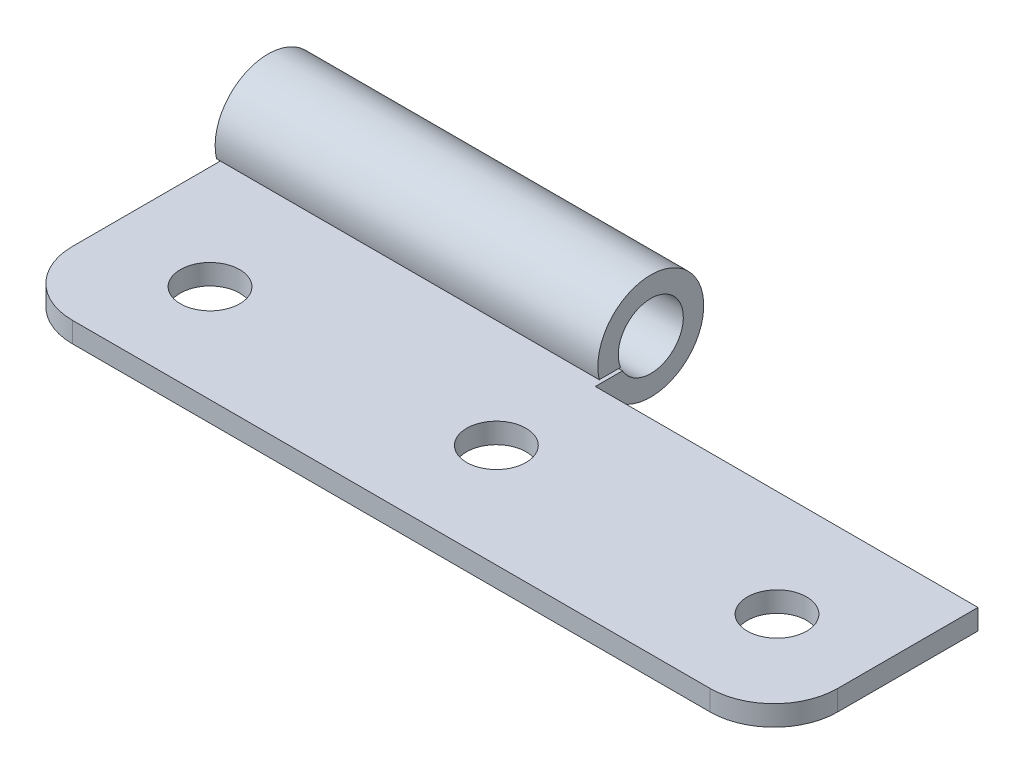
ISO-10303-21;
HEADER;
FILE_DESCRIPTION(('STEP AP214'),'2;1');
FILE_NAME('part.step','',(''),(''),'','','');
FILE_SCHEMA(('AUTOMOTIVE_DESIGN { 1 0 10303 214 1 1 1 1 }'));
ENDSEC;
DATA;
#1=APPLICATION_CONTEXT('core data for automotive mechanical design processes');
#2=APPLICATION_PROTOCOL_DEFINITION('international standard','automotive_design',2000,#1);
#3=PRODUCT_CONTEXT('',#1,'mechanical');
#4=PRODUCT('Part','Part','',(#3));
#5=PRODUCT_RELATED_PRODUCT_CATEGORY('part','',(#4));
#6=PRODUCT_DEFINITION_FORMATION('','',#4);
#7=PRODUCT_DEFINITION_CONTEXT('part definition',#1,'design');
#8=PRODUCT_DEFINITION('design','',#6,#7);
#9=PRODUCT_DEFINITION_SHAPE('','',#8);
#10=(LENGTH_UNIT() NAMED_UNIT(*) SI_UNIT(.MILLI.,.METRE.));
#11=(NAMED_UNIT(*) PLANE_ANGLE_UNIT() SI_UNIT($,.RADIAN.));
#12=(NAMED_UNIT(*) SI_UNIT($,.STERADIAN.) SOLID_ANGLE_UNIT());
#13=UNCERTAINTY_MEASURE_WITH_UNIT(LENGTH_MEASURE(1.E-05),#10,'distance_accuracy_value','');
#14=(GEOMETRIC_REPRESENTATION_CONTEXT(3) GLOBAL_UNCERTAINTY_ASSIGNED_CONTEXT((#13)) GLOBAL_UNIT_ASSIGNED_CONTEXT((#10,
#11,#12)) REPRESENTATION_CONTEXT('',''));
#15=CARTESIAN_POINT('',(0.,0.,0.));
#16=DIRECTION('',(0.,0.,1.));
#17=DIRECTION('',(1.,0.,0.));
#18=AXIS2_PLACEMENT_3D('',#15,#16,#17);
#19=CARTESIAN_POINT('',(60.,0.,0.));
#20=DIRECTION('',(-1.,0.,0.));
#21=DIRECTION('',(0.,0.,1.));
#22=AXIS2_PLACEMENT_3D('',#19,#20,#21);
#23=CYLINDRICAL_SURFACE('',#22,4.15);
#24=CARTESIAN_POINT('',(30.,0.,0.));
#25=DIRECTION('',(-1.,0.,0.));
#26=DIRECTION('',(0.,0.,1.));
#27=AXIS2_PLACEMENT_3D('',#24,#25,#26);
#28=CIRCLE('',#27,4.15);
#29=CARTESIAN_POINT('',(30.,-0.95,4.03980197534483));
#30=VERTEX_POINT('',#29);
#31=CARTESIAN_POINT('',(30.,-2.85,3.01662062579967));
#32=VERTEX_POINT('',#31);
#33=EDGE_CURVE('E56',#30,#32,#28,.T.);
#34=ORIENTED_EDGE('',*,*,#33,.T.);
#35=DIRECTION('',(-1.,0.,0.));
#36=VECTOR('',#35,1.);
#37=CARTESIAN_POINT('',(60.,-2.85,3.01662062579967));
#38=LINE('',#37,#36);
#39=CARTESIAN_POINT('',(0.,-2.85,3.01662062579967));
#40=VERTEX_POINT('',#39);
#41=EDGE_CURVE('E153',#32,#40,#38,.T.);
#42=ORIENTED_EDGE('',*,*,#41,.T.);
#43=CARTESIAN_POINT('',(0.,0.,0.));
#44=DIRECTION('',(1.,0.,0.));
#45=DIRECTION('',(0.,0.,-1.));
#46=AXIS2_PLACEMENT_3D('',#43,#44,#45);
#47=CIRCLE('',#46,4.15);
#48=CARTESIAN_POINT('',(0.,-0.95,4.03980197534483));
#49=VERTEX_POINT('',#48);
#50=EDGE_CURVE('E155',#40,#49,#47,.T.);
#51=ORIENTED_EDGE('',*,*,#50,.T.);
#52=DIRECTION('',(-1.,0.,0.));
#53=VECTOR('',#52,1.);
#54=CARTESIAN_POINT('',(60.,-0.95,4.03980197534483));
#55=LINE('',#54,#53);
#56=EDGE_CURVE('E63',#30,#49,#55,.T.);
#57=ORIENTED_EDGE('',*,*,#56,.F.);
#58=EDGE_LOOP('',(#34,#42,#51,#57));
#59=FACE_BOUND('',#58,.T.);
#60=ADVANCED_FACE('F41',(#59),#23,.T.);
#61=CARTESIAN_POINT('',(60.,0.,0.));
#62=DIRECTION('',(1.,0.,0.));
#63=DIRECTION('',(0.,0.,-1.));
#64=AXIS2_PLACEMENT_3D('',#61,#62,#63);
#65=PLANE('',#64);
#66=DIRECTION('',(0.,1.,0.));
#67=VECTOR('',#66,1.);
#68=CARTESIAN_POINT('',(60.,-4.15,4.35000000000001));
#69=LINE('',#68,#67);
#70=CARTESIAN_POINT('',(60.,-2.85,4.35000000000001));
#71=VERTEX_POINT('',#70);
#72=CARTESIAN_POINT('',(60.,-1.25,4.35000000000001));
#73=VERTEX_POINT('',#72);
#74=EDGE_CURVE('E117',#71,#73,#69,.T.);
#75=ORIENTED_EDGE('',*,*,#74,.T.);
#76=DIRECTION('',(0.,0.,-1.));
#77=VECTOR('',#76,1.);
#78=CARTESIAN_POINT('',(60.,-1.25,4.15));
#79=LINE('',#78,#77);
#80=CARTESIAN_POINT('',(60.,-1.25,15.35));
#81=VERTEX_POINT('',#80);
#82=EDGE_CURVE('E156',#81,#73,#79,.T.);
#83=ORIENTED_EDGE('',*,*,#82,.F.);
#84=DIRECTION('',(0.,-1.,0.));
#85=VECTOR('',#84,1.);
#86=CARTESIAN_POINT('',(60.,-2.85,15.35));
#87=LINE('',#86,#85);
#88=CARTESIAN_POINT('',(60.,-2.85,15.35));
#89=VERTEX_POINT('',#88);
#90=EDGE_CURVE('E142',#81,#89,#87,.T.);
#91=ORIENTED_EDGE('',*,*,#90,.T.);
#92=DIRECTION('',(0.,0.,-1.));
#93=VECTOR('',#92,1.);
#94=CARTESIAN_POINT('',(60.,-2.85,0.));
#95=LINE('',#94,#93);
#96=EDGE_CURVE('E136',#89,#71,#95,.T.);
#97=ORIENTED_EDGE('',*,*,#96,.T.);
#98=EDGE_LOOP('',(#75,#83,#91,#97));
#99=FACE_BOUND('',#98,.T.);
#100=ADVANCED_FACE('F140',(#99),#65,.T.);
#101=CARTESIAN_POINT('',(0.,0.,0.));
#102=DIRECTION('',(1.,0.,0.));
#103=DIRECTION('',(0.,0.,-1.));
#104=AXIS2_PLACEMENT_3D('',#101,#102,#103);
#105=PLANE('',#104);
#106=DIRECTION('',(0.,0.,1.));
#107=VECTOR('',#106,1.);
#108=CARTESIAN_POINT('',(0.,-1.25,4.15));
#109=LINE('',#108,#107);
#110=CARTESIAN_POINT('',(0.,-1.25,2.22261107708929));
#111=VERTEX_POINT('',#110);
#112=CARTESIAN_POINT('',(0.,-1.25,15.35));
#113=VERTEX_POINT('',#112);
#114=EDGE_CURVE('E143',#111,#113,#109,.T.);
#115=ORIENTED_EDGE('',*,*,#114,.F.);
#116=CARTESIAN_POINT('',(0.,0.,0.));
#117=DIRECTION('',(-1.,0.,0.));
#118=DIRECTION('',(0.,0.,1.));
#119=AXIS2_PLACEMENT_3D('',#116,#117,#118);
#120=CIRCLE('',#119,2.55);
#121=CARTESIAN_POINT('',(0.,-0.95,2.36643191323985));
#122=VERTEX_POINT('',#121);
#123=EDGE_CURVE('E181',#122,#111,#120,.T.);
#124=ORIENTED_EDGE('',*,*,#123,.F.);
#125=DIRECTION('',(0.,0.,-1.));
#126=VECTOR('',#125,1.);
#127=CARTESIAN_POINT('',(0.,-0.95,4.03980197534483));
#128=LINE('',#127,#126);
#129=EDGE_CURVE('E186',#49,#122,#128,.T.);
#130=ORIENTED_EDGE('',*,*,#129,.F.);
#131=ORIENTED_EDGE('',*,*,#50,.F.);
#132=DIRECTION('',(0.,0.,1.));
#133=VECTOR('',#132,1.);
#134=CARTESIAN_POINT('',(0.,-2.85,4.15));
#135=LINE('',#134,#133);
#136=CARTESIAN_POINT('',(0.,-2.85,15.35));
#137=VERTEX_POINT('',#136);
#138=EDGE_CURVE('E149',#40,#137,#135,.T.);
#139=ORIENTED_EDGE('',*,*,#138,.T.);
#140=DIRECTION('',(0.,-1.,0.));
#141=VECTOR('',#140,1.);
#142=CARTESIAN_POINT('',(0.,0.,15.35));
#143=LINE('',#142,#141);
#144=EDGE_CURVE('E173',#137,#113,#143,.F.);
#145=ORIENTED_EDGE('',*,*,#144,.T.);
#146=EDGE_LOOP('',(#115,#124,#130,#131,#139,#145));
#147=FACE_BOUND('',#146,.T.);
#148=ADVANCED_FACE('F215',(#147),#105,.F.);
#149=CARTESIAN_POINT('',(0.,-1.25,0.));
#150=DIRECTION('',(0.,-1.,0.));
#151=DIRECTION('',(0.,0.,-1.));
#152=AXIS2_PLACEMENT_3D('',#149,#150,#151);
#153=PLANE('',#152);
#154=CARTESIAN_POINT('',(8.12499999999999,-1.25,12.675));
#155=DIRECTION('',(0.,1.,0.));
#156=DIRECTION('',(0.,0.,1.));
#157=AXIS2_PLACEMENT_3D('',#154,#155,#156);
#158=CIRCLE('',#157,2.32500000000001);
#159=CARTESIAN_POINT('',(8.12499999999999,-1.25,15.));
#160=VERTEX_POINT('',#159);
#161=EDGE_CURVE('E203',#160,#160,#158,.T.);
#162=ORIENTED_EDGE('',*,*,#161,.F.);
#163=EDGE_LOOP('',(#162));
#164=FACE_BOUND('',#163,.T.);
#165=CARTESIAN_POINT('',(30.1191632833642,-1.25,12.225));
#166=DIRECTION('',(0.,1.,0.));
#167=DIRECTION('',(0.,0.,1.));
#168=AXIS2_PLACEMENT_3D('',#165,#166,#167);
#169=CIRCLE('',#168,2.32499999999999);
#170=CARTESIAN_POINT('',(30.1191632833642,-1.25,14.55));
#171=VERTEX_POINT('',#170);
#172=EDGE_CURVE('E197',#171,#171,#169,.T.);
#173=ORIENTED_EDGE('',*,*,#172,.F.);
#174=EDGE_LOOP('',(#173));
#175=FACE_BOUND('',#174,.T.);
#176=CARTESIAN_POINT('',(52.5691632833642,-1.25,12.675));
#177=DIRECTION('',(0.,1.,0.));
#178=DIRECTION('',(0.,0.,1.));
#179=AXIS2_PLACEMENT_3D('',#176,#177,#178);
#180=CIRCLE('',#179,2.32499999999999);
#181=CARTESIAN_POINT('',(52.5691632833642,-1.25,15.));
#182=VERTEX_POINT('',#181);
#183=EDGE_CURVE('E190',#182,#182,#180,.T.);
#184=ORIENTED_EDGE('',*,*,#183,.F.);
#185=EDGE_LOOP('',(#184));
#186=FACE_BOUND('',#185,.T.);
#187=DIRECTION('',(-1.,0.,0.));
#188=VECTOR('',#187,1.);
#189=CARTESIAN_POINT('',(0.,-1.25,4.35000000000001));
#190=LINE('',#189,#188);
#191=CARTESIAN_POINT('',(30.,-1.25,4.35000000000001));
#192=VERTEX_POINT('',#191);
#193=EDGE_CURVE('E123',#73,#192,#190,.T.);
#194=ORIENTED_EDGE('',*,*,#193,.T.);
#195=DIRECTION('',(0.,0.,-1.));
#196=VECTOR('',#195,1.);
#197=CARTESIAN_POINT('',(30.,-1.25,0.));
#198=LINE('',#197,#196);
#199=CARTESIAN_POINT('',(30.,-1.25,2.22261107708929));
#200=VERTEX_POINT('',#199);
#201=EDGE_CURVE('E230',#192,#200,#198,.T.);
#202=ORIENTED_EDGE('',*,*,#201,.T.);
#203=DIRECTION('',(-1.,0.,0.));
#204=VECTOR('',#203,1.);
#205=CARTESIAN_POINT('',(60.,-1.25,2.22261107708929));
#206=LINE('',#205,#204);
#207=EDGE_CURVE('E183',#200,#111,#206,.T.);
#208=ORIENTED_EDGE('',*,*,#207,.T.);
#209=ORIENTED_EDGE('',*,*,#114,.T.);
#210=CARTESIAN_POINT('',(5.,-1.25,15.35));
#211=DIRECTION('',(0.,-1.,0.));
#212=DIRECTION('',(0.,0.,-1.));
#213=AXIS2_PLACEMENT_3D('',#210,#211,#212);
#214=CIRCLE('',#213,5.);
#215=CARTESIAN_POINT('',(5.,-1.25,20.35));
#216=VERTEX_POINT('',#215);
#217=EDGE_CURVE('E169',#113,#216,#214,.F.);
#218=ORIENTED_EDGE('',*,*,#217,.T.);
#219=DIRECTION('',(1.,0.,0.));
#220=VECTOR('',#219,1.);
#221=CARTESIAN_POINT('',(0.,-1.25,20.35));
#222=LINE('',#221,#220);
#223=CARTESIAN_POINT('',(55.,-1.25,20.35));
#224=VERTEX_POINT('',#223);
#225=EDGE_CURVE('E146',#216,#224,#222,.T.);
#226=ORIENTED_EDGE('',*,*,#225,.T.);
#227=CARTESIAN_POINT('',(55.,-1.25,15.35));
#228=DIRECTION('',(0.,-1.,0.));
#229=DIRECTION('',(0.,0.,-1.));
#230=AXIS2_PLACEMENT_3D('',#227,#228,#229);
#231=CIRCLE('',#230,5.);
#232=EDGE_CURVE('E171',#224,#81,#231,.F.);
#233=ORIENTED_EDGE('',*,*,#232,.T.);
#234=ORIENTED_EDGE('',*,*,#82,.T.);
#235=EDGE_LOOP('',(#194,#202,#208,#209,#218,#226,#233,#234));
#236=FACE_BOUND('',#235,.T.);
#237=ADVANCED_FACE('F221',(#164,#175,#186,#236),#153,.F.);
#238=CARTESIAN_POINT('',(0.,-2.85,0.));
#239=DIRECTION('',(0.,-1.,0.));
#240=DIRECTION('',(0.,0.,-1.));
#241=AXIS2_PLACEMENT_3D('',#238,#239,#240);
#242=PLANE('',#241);
#243=DIRECTION('',(0.,0.,-1.));
#244=VECTOR('',#243,1.);
#245=CARTESIAN_POINT('',(30.,-2.85,0.));
#246=LINE('',#245,#244);
#247=CARTESIAN_POINT('',(30.,-2.85,4.35000000000001));
#248=VERTEX_POINT('',#247);
#249=EDGE_CURVE('E138',#248,#32,#246,.T.);
#250=ORIENTED_EDGE('',*,*,#249,.F.);
#251=DIRECTION('',(-1.,0.,0.));
#252=VECTOR('',#251,1.);
#253=CARTESIAN_POINT('',(0.,-2.85,4.35000000000001));
#254=LINE('',#253,#252);
#255=EDGE_CURVE('E11',#71,#248,#254,.T.);
#256=ORIENTED_EDGE('',*,*,#255,.F.);
#257=ORIENTED_EDGE('',*,*,#96,.F.);
#258=CARTESIAN_POINT('',(55.,-2.85,15.35));
#259=DIRECTION('',(0.,-1.,0.));
#260=DIRECTION('',(0.,0.,-1.));
#261=AXIS2_PLACEMENT_3D('',#258,#259,#260);
#262=CIRCLE('',#261,5.);
#263=CARTESIAN_POINT('',(55.,-2.85,20.35));
#264=VERTEX_POINT('',#263);
#265=EDGE_CURVE('E162',#89,#264,#262,.T.);
#266=ORIENTED_EDGE('',*,*,#265,.T.);
#267=DIRECTION('',(1.,0.,0.));
#268=VECTOR('',#267,1.);
#269=CARTESIAN_POINT('',(0.,-2.85,20.35));
#270=LINE('',#269,#268);
#271=CARTESIAN_POINT('',(5.,-2.85,20.35));
#272=VERTEX_POINT('',#271);
#273=EDGE_CURVE('E144',#272,#264,#270,.T.);
#274=ORIENTED_EDGE('',*,*,#273,.F.);
#275=CARTESIAN_POINT('',(5.,-2.85,15.35));
#276=DIRECTION('',(0.,-1.,0.));
#277=DIRECTION('',(0.,0.,-1.));
#278=AXIS2_PLACEMENT_3D('',#275,#276,#277);
#279=CIRCLE('',#278,5.);
#280=EDGE_CURVE('E160',#272,#137,#279,.T.);
#281=ORIENTED_EDGE('',*,*,#280,.T.);
#282=ORIENTED_EDGE('',*,*,#138,.F.);
#283=ORIENTED_EDGE('',*,*,#41,.F.);
#284=EDGE_LOOP('',(#250,#256,#257,#266,#274,#281,#282,#283));
#285=FACE_BOUND('',#284,.T.);
#286=CARTESIAN_POINT('',(52.5691632833642,-2.85,12.675));
#287=DIRECTION('',(0.,1.,0.));
#288=DIRECTION('',(0.,0.,1.));
#289=AXIS2_PLACEMENT_3D('',#286,#287,#288);
#290=CIRCLE('',#289,2.32499999999999);
#291=CARTESIAN_POINT('',(52.5691632833642,-2.85,15.));
#292=VERTEX_POINT('',#291);
#293=EDGE_CURVE('E194',#292,#292,#290,.T.);
#294=ORIENTED_EDGE('',*,*,#293,.T.);
#295=EDGE_LOOP('',(#294));
#296=FACE_BOUND('',#295,.T.);
#297=CARTESIAN_POINT('',(8.12499999999999,-2.85,12.675));
#298=DIRECTION('',(0.,1.,0.));
#299=DIRECTION('',(0.,0.,1.));
#300=AXIS2_PLACEMENT_3D('',#297,#298,#299);
#301=CIRCLE('',#300,2.32500000000001);
#302=CARTESIAN_POINT('',(8.12499999999999,-2.85,15.));
#303=VERTEX_POINT('',#302);
#304=EDGE_CURVE('E200',#303,#303,#301,.T.);
#305=ORIENTED_EDGE('',*,*,#304,.T.);
#306=EDGE_LOOP('',(#305));
#307=FACE_BOUND('',#306,.T.);
#308=CARTESIAN_POINT('',(30.1191632833642,-2.85,12.225));
#309=DIRECTION('',(0.,1.,0.));
#310=DIRECTION('',(0.,0.,1.));
#311=AXIS2_PLACEMENT_3D('',#308,#309,#310);
#312=CIRCLE('',#311,2.32499999999999);
#313=CARTESIAN_POINT('',(30.1191632833642,-2.85,14.55));
#314=VERTEX_POINT('',#313);
#315=EDGE_CURVE('E193',#314,#314,#312,.T.);
#316=ORIENTED_EDGE('',*,*,#315,.T.);
#317=EDGE_LOOP('',(#316));
#318=FACE_BOUND('',#317,.T.);
#319=ADVANCED_FACE('F134',(#285,#296,#307,#318),#242,.T.);
#320=CARTESIAN_POINT('',(0.,-1.25,20.35));
#321=DIRECTION('',(0.,0.,-1.));
#322=DIRECTION('',(-1.,0.,0.));
#323=AXIS2_PLACEMENT_3D('',#320,#321,#322);
#324=PLANE('',#323);
#325=ORIENTED_EDGE('',*,*,#273,.T.);
#326=DIRECTION('',(0.,-1.,0.));
#327=VECTOR('',#326,1.);
#328=CARTESIAN_POINT('',(55.,-1.25,20.35));
#329=LINE('',#328,#327);
#330=EDGE_CURVE('E167',#264,#224,#329,.F.);
#331=ORIENTED_EDGE('',*,*,#330,.T.);
#332=ORIENTED_EDGE('',*,*,#225,.F.);
#333=DIRECTION('',(0.,-1.,0.));
#334=VECTOR('',#333,1.);
#335=CARTESIAN_POINT('',(5.,-1.25,20.35));
#336=LINE('',#335,#334);
#337=EDGE_CURVE('E164',#216,#272,#336,.T.);
#338=ORIENTED_EDGE('',*,*,#337,.T.);
#339=EDGE_LOOP('',(#325,#331,#332,#338));
#340=FACE_BOUND('',#339,.T.);
#341=ADVANCED_FACE('F224',(#340),#324,.F.);
#342=CARTESIAN_POINT('',(8.12499999999999,-1.25,12.675));
#343=DIRECTION('',(0.,-1.,0.));
#344=DIRECTION('',(0.,0.,-1.));
#345=AXIS2_PLACEMENT_3D('',#342,#343,#344);
#346=CYLINDRICAL_SURFACE('',#345,2.32500000000001);
#347=ORIENTED_EDGE('',*,*,#161,.T.);
#348=EDGE_LOOP('',(#347));
#349=FACE_BOUND('',#348,.T.);
#350=ORIENTED_EDGE('',*,*,#304,.F.);
#351=EDGE_LOOP('',(#350));
#352=FACE_BOUND('',#351,.T.);
#353=ADVANCED_FACE('F271',(#349,#352),#346,.F.);
#354=CARTESIAN_POINT('',(30.1191632833642,-1.25,12.225));
#355=DIRECTION('',(0.,-1.,0.));
#356=DIRECTION('',(0.,0.,-1.));
#357=AXIS2_PLACEMENT_3D('',#354,#355,#356);
#358=CYLINDRICAL_SURFACE('',#357,2.32499999999999);
#359=ORIENTED_EDGE('',*,*,#172,.T.);
#360=EDGE_LOOP('',(#359));
#361=FACE_BOUND('',#360,.T.);
#362=ORIENTED_EDGE('',*,*,#315,.F.);
#363=EDGE_LOOP('',(#362));
#364=FACE_BOUND('',#363,.T.);
#365=ADVANCED_FACE('F265',(#361,#364),#358,.F.);
#366=CARTESIAN_POINT('',(52.5691632833642,-1.25,12.675));
#367=DIRECTION('',(0.,-1.,0.));
#368=DIRECTION('',(0.,0.,-1.));
#369=AXIS2_PLACEMENT_3D('',#366,#367,#368);
#370=CYLINDRICAL_SURFACE('',#369,2.32499999999999);
#371=ORIENTED_EDGE('',*,*,#183,.T.);
#372=EDGE_LOOP('',(#371));
#373=FACE_BOUND('',#372,.T.);
#374=ORIENTED_EDGE('',*,*,#293,.F.);
#375=EDGE_LOOP('',(#374));
#376=FACE_BOUND('',#375,.T.);
#377=ADVANCED_FACE('F259',(#373,#376),#370,.F.);
#378=CARTESIAN_POINT('',(55.,0.,15.35));
#379=DIRECTION('',(0.,1.,0.));
#380=DIRECTION('',(0.,0.,1.));
#381=AXIS2_PLACEMENT_3D('',#378,#379,#380);
#382=CYLINDRICAL_SURFACE('',#381,5.);
#383=ORIENTED_EDGE('',*,*,#232,.F.);
#384=ORIENTED_EDGE('',*,*,#330,.F.);
#385=ORIENTED_EDGE('',*,*,#265,.F.);
#386=ORIENTED_EDGE('',*,*,#90,.F.);
#387=EDGE_LOOP('',(#383,#384,#385,#386));
#388=FACE_BOUND('',#387,.T.);
#389=ADVANCED_FACE('F228',(#388),#382,.T.);
#390=CARTESIAN_POINT('',(5.,-1.25,15.35));
#391=DIRECTION('',(0.,-1.,0.));
#392=DIRECTION('',(0.,0.,-1.));
#393=AXIS2_PLACEMENT_3D('',#390,#391,#392);
#394=CYLINDRICAL_SURFACE('',#393,5.);
#395=ORIENTED_EDGE('',*,*,#217,.F.);
#396=ORIENTED_EDGE('',*,*,#144,.F.);
#397=ORIENTED_EDGE('',*,*,#280,.F.);
#398=ORIENTED_EDGE('',*,*,#337,.F.);
#399=EDGE_LOOP('',(#395,#396,#397,#398));
#400=FACE_BOUND('',#399,.T.);
#401=ADVANCED_FACE('F43',(#400),#394,.T.);
#402=CARTESIAN_POINT('',(60.,0.,0.));
#403=DIRECTION('',(-1.,0.,0.));
#404=DIRECTION('',(0.,0.,1.));
#405=AXIS2_PLACEMENT_3D('',#402,#403,#404);
#406=CYLINDRICAL_SURFACE('',#405,2.55);
#407=ORIENTED_EDGE('',*,*,#207,.F.);
#408=CARTESIAN_POINT('',(30.,0.,0.));
#409=DIRECTION('',(-1.,0.,0.));
#410=DIRECTION('',(0.,0.,1.));
#411=AXIS2_PLACEMENT_3D('',#408,#409,#410);
#412=CIRCLE('',#411,2.55);
#413=CARTESIAN_POINT('',(30.,-0.95,2.36643191323985));
#414=VERTEX_POINT('',#413);
#415=EDGE_CURVE('E128',#200,#414,#412,.F.);
#416=ORIENTED_EDGE('',*,*,#415,.T.);
#417=DIRECTION('',(-1.,0.,0.));
#418=VECTOR('',#417,1.);
#419=CARTESIAN_POINT('',(60.,-0.95,2.36643191323985));
#420=LINE('',#419,#418);
#421=EDGE_CURVE('E177',#414,#122,#420,.T.);
#422=ORIENTED_EDGE('',*,*,#421,.T.);
#423=ORIENTED_EDGE('',*,*,#123,.T.);
#424=EDGE_LOOP('',(#407,#416,#422,#423));
#425=FACE_BOUND('',#424,.T.);
#426=ADVANCED_FACE('F238',(#425),#406,.F.);
#427=CARTESIAN_POINT('',(60.,-0.95,4.03980197534483));
#428=DIRECTION('',(0.,1.,0.));
#429=DIRECTION('',(0.,0.,1.));
#430=AXIS2_PLACEMENT_3D('',#427,#428,#429);
#431=PLANE('',#430);
#432=ORIENTED_EDGE('',*,*,#421,.F.);
#433=DIRECTION('',(0.,0.,1.));
#434=VECTOR('',#433,1.);
#435=CARTESIAN_POINT('',(30.,-0.95,4.03980197534483));
#436=LINE('',#435,#434);
#437=EDGE_CURVE('E49',#414,#30,#436,.T.);
#438=ORIENTED_EDGE('',*,*,#437,.T.);
#439=ORIENTED_EDGE('',*,*,#56,.T.);
#440=ORIENTED_EDGE('',*,*,#129,.T.);
#441=EDGE_LOOP('',(#432,#438,#439,#440));
#442=FACE_BOUND('',#441,.T.);
#443=ADVANCED_FACE('F176',(#442),#431,.F.);
#444=CARTESIAN_POINT('',(30.,-4.15,4.35000000000001));
#445=DIRECTION('',(0.,0.,1.));
#446=DIRECTION('',(1.,0.,0.));
#447=AXIS2_PLACEMENT_3D('',#444,#445,#446);
#448=PLANE('',#447);
#449=ORIENTED_EDGE('',*,*,#74,.F.);
#450=ORIENTED_EDGE('',*,*,#255,.T.);
#451=DIRECTION('',(0.,1.,0.));
#452=VECTOR('',#451,1.);
#453=CARTESIAN_POINT('',(30.,-4.15,4.35000000000001));
#454=LINE('',#453,#452);
#455=EDGE_CURVE('E129',#248,#192,#454,.T.);
#456=ORIENTED_EDGE('',*,*,#455,.T.);
#457=ORIENTED_EDGE('',*,*,#193,.F.);
#458=EDGE_LOOP('',(#449,#450,#456,#457));
#459=FACE_BOUND('',#458,.T.);
#460=ADVANCED_FACE('F119',(#459),#448,.F.);
#461=CARTESIAN_POINT('',(30.,-4.15,-4.15));
#462=DIRECTION('',(-1.,0.,0.));
#463=DIRECTION('',(0.,0.,1.));
#464=AXIS2_PLACEMENT_3D('',#461,#462,#463);
#465=PLANE('',#464);
#466=ORIENTED_EDGE('',*,*,#249,.T.);
#467=ORIENTED_EDGE('',*,*,#33,.F.);
#468=ORIENTED_EDGE('',*,*,#437,.F.);
#469=ORIENTED_EDGE('',*,*,#415,.F.);
#470=ORIENTED_EDGE('',*,*,#201,.F.);
#471=ORIENTED_EDGE('',*,*,#455,.F.);
#472=EDGE_LOOP('',(#466,#467,#468,#469,#470,#471));
#473=FACE_BOUND('',#472,.T.);
#474=ADVANCED_FACE('F242',(#473),#465,.F.);
#475=CLOSED_SHELL('',(#60,#100,#148,#237,#319,#341,#353,#365,#377,#389,#401,#426,#443,#460,#474));
#476=MANIFOLD_SOLID_BREP('B2',#475);
#477=ADVANCED_BREP_SHAPE_REPRESENTATION('',(#18,#476),#14);
#478=SHAPE_DEFINITION_REPRESENTATION(#9,#477);
ENDSEC;
END-ISO-10303-21;
